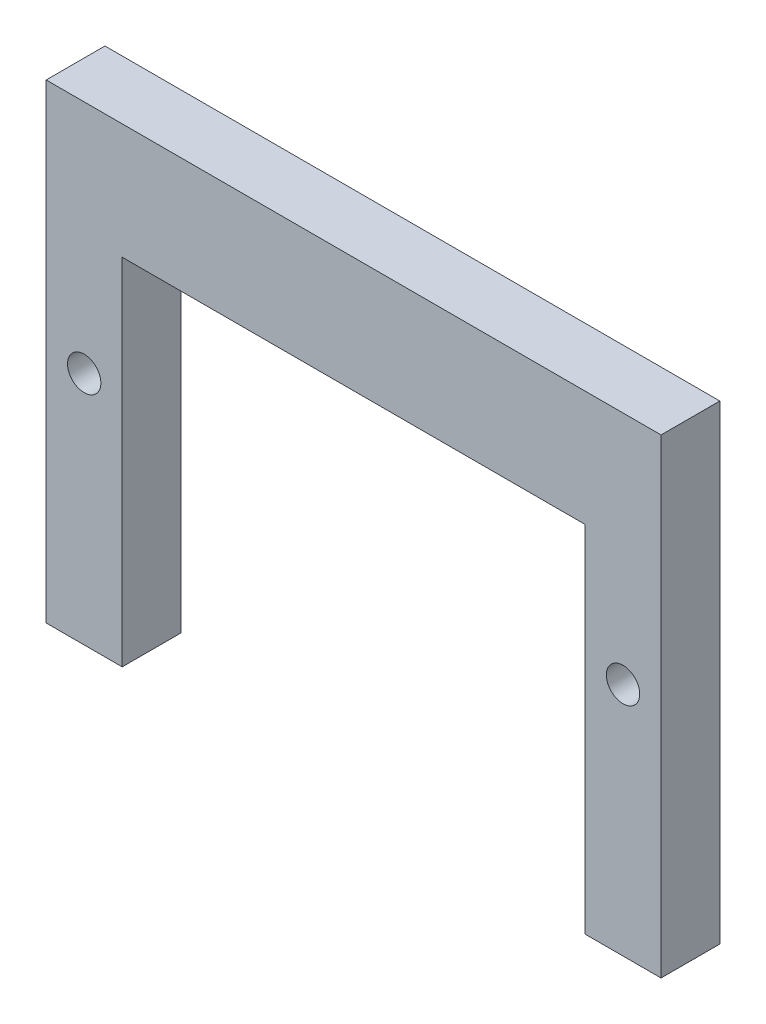
ISO-10303-21;
HEADER;
FILE_DESCRIPTION(('STEP AP214'),'2;1');
FILE_NAME('part.step','',(''),(''),'','','');
FILE_SCHEMA(('AUTOMOTIVE_DESIGN { 1 0 10303 214 1 1 1 1 }'));
ENDSEC;
DATA;
#1=APPLICATION_CONTEXT('core data for automotive mechanical design processes');
#2=APPLICATION_PROTOCOL_DEFINITION('international standard','automotive_design',2000,#1);
#3=PRODUCT_CONTEXT('',#1,'mechanical');
#4=PRODUCT('Part','Part','',(#3));
#5=PRODUCT_RELATED_PRODUCT_CATEGORY('part','',(#4));
#6=PRODUCT_DEFINITION_FORMATION('','',#4);
#7=PRODUCT_DEFINITION_CONTEXT('part definition',#1,'design');
#8=PRODUCT_DEFINITION('design','',#6,#7);
#9=PRODUCT_DEFINITION_SHAPE('','',#8);
#10=(LENGTH_UNIT() NAMED_UNIT(*) SI_UNIT(.MILLI.,.METRE.));
#11=(NAMED_UNIT(*) PLANE_ANGLE_UNIT() SI_UNIT($,.RADIAN.));
#12=(NAMED_UNIT(*) SI_UNIT($,.STERADIAN.) SOLID_ANGLE_UNIT());
#13=UNCERTAINTY_MEASURE_WITH_UNIT(LENGTH_MEASURE(1.E-05),#10,'distance_accuracy_value','');
#14=(GEOMETRIC_REPRESENTATION_CONTEXT(3) GLOBAL_UNCERTAINTY_ASSIGNED_CONTEXT((#13)) GLOBAL_UNIT_ASSIGNED_CONTEXT((#10,
#11,#12)) REPRESENTATION_CONTEXT('',''));
#15=CARTESIAN_POINT('',(0.,0.,0.));
#16=DIRECTION('',(0.,0.,1.));
#17=DIRECTION('',(1.,0.,0.));
#18=AXIS2_PLACEMENT_3D('',#15,#16,#17);
#19=CARTESIAN_POINT('',(0.,0.,3.));
#20=DIRECTION('',(0.,0.,1.));
#21=DIRECTION('',(1.,0.,0.));
#22=AXIS2_PLACEMENT_3D('',#19,#20,#21);
#23=PLANE('',#22);
#24=CARTESIAN_POINT('',(-13.751,12.0021,3.));
#25=DIRECTION('',(0.,0.,1.));
#26=DIRECTION('',(1.,0.,0.));
#27=AXIS2_PLACEMENT_3D('',#24,#25,#26);
#28=CIRCLE('',#27,0.850900000000001);
#29=CARTESIAN_POINT('',(-12.9001,12.0021,3.));
#30=VERTEX_POINT('',#29);
#31=EDGE_CURVE('E134',#30,#30,#28,.T.);
#32=ORIENTED_EDGE('',*,*,#31,.F.);
#33=EDGE_LOOP('',(#32));
#34=FACE_BOUND('',#33,.T.);
#35=DIRECTION('',(0.,-1.,0.));
#36=VECTOR('',#35,1.);
#37=CARTESIAN_POINT('',(-15.691,24.0041,3.));
#38=LINE('',#37,#36);
#39=CARTESIAN_POINT('',(-15.691,24.0041,3.));
#40=VERTEX_POINT('',#39);
#41=CARTESIAN_POINT('',(-15.691,0.,3.));
#42=VERTEX_POINT('',#41);
#43=EDGE_CURVE('E145',#40,#42,#38,.T.);
#44=ORIENTED_EDGE('',*,*,#43,.T.);
#45=DIRECTION('',(1.,0.,0.));
#46=VECTOR('',#45,1.);
#47=CARTESIAN_POINT('',(-15.691,0.,3.));
#48=LINE('',#47,#46);
#49=CARTESIAN_POINT('',(-11.811,0.,3.));
#50=VERTEX_POINT('',#49);
#51=EDGE_CURVE('E93',#42,#50,#48,.T.);
#52=ORIENTED_EDGE('',*,*,#51,.T.);
#53=DIRECTION('',(0.,1.,0.));
#54=VECTOR('',#53,1.);
#55=CARTESIAN_POINT('',(-11.811,0.,3.));
#56=LINE('',#55,#54);
#57=CARTESIAN_POINT('',(-11.811,18.1091,3.));
#58=VERTEX_POINT('',#57);
#59=EDGE_CURVE('E160',#50,#58,#56,.T.);
#60=ORIENTED_EDGE('',*,*,#59,.T.);
#61=DIRECTION('',(1.,0.,0.));
#62=VECTOR('',#61,1.);
#63=CARTESIAN_POINT('',(-11.811,18.1091,3.));
#64=LINE('',#63,#62);
#65=CARTESIAN_POINT('',(11.811,18.1091,3.));
#66=VERTEX_POINT('',#65);
#67=EDGE_CURVE('E173',#58,#66,#64,.T.);
#68=ORIENTED_EDGE('',*,*,#67,.T.);
#69=DIRECTION('',(0.,-1.,0.));
#70=VECTOR('',#69,1.);
#71=CARTESIAN_POINT('',(11.811,0.,3.));
#72=LINE('',#71,#70);
#73=CARTESIAN_POINT('',(11.811,0.,3.));
#74=VERTEX_POINT('',#73);
#75=EDGE_CURVE('E112',#66,#74,#72,.T.);
#76=ORIENTED_EDGE('',*,*,#75,.T.);
#77=DIRECTION('',(1.,0.,0.));
#78=VECTOR('',#77,1.);
#79=CARTESIAN_POINT('',(15.691,0.,3.));
#80=LINE('',#79,#78);
#81=CARTESIAN_POINT('',(15.691,0.,3.));
#82=VERTEX_POINT('',#81);
#83=EDGE_CURVE('E106',#74,#82,#80,.T.);
#84=ORIENTED_EDGE('',*,*,#83,.T.);
#85=DIRECTION('',(0.,1.,0.));
#86=VECTOR('',#85,1.);
#87=CARTESIAN_POINT('',(15.691,24.0041,3.));
#88=LINE('',#87,#86);
#89=CARTESIAN_POINT('',(15.691,24.0041,3.));
#90=VERTEX_POINT('',#89);
#91=EDGE_CURVE('E110',#82,#90,#88,.T.);
#92=ORIENTED_EDGE('',*,*,#91,.T.);
#93=DIRECTION('',(-1.,0.,0.));
#94=VECTOR('',#93,1.);
#95=CARTESIAN_POINT('',(15.691,24.0041,3.));
#96=LINE('',#95,#94);
#97=EDGE_CURVE('E50',#90,#40,#96,.T.);
#98=ORIENTED_EDGE('',*,*,#97,.T.);
#99=EDGE_LOOP('',(#44,#52,#60,#68,#76,#84,#92,#98));
#100=FACE_BOUND('',#99,.T.);
#101=CARTESIAN_POINT('',(13.751,12.0021,3.));
#102=DIRECTION('',(0.,0.,1.));
#103=DIRECTION('',(-1.,0.,0.));
#104=AXIS2_PLACEMENT_3D('',#101,#102,#103);
#105=CIRCLE('',#104,0.850900000000001);
#106=CARTESIAN_POINT('',(12.9001,12.0021,3.));
#107=VERTEX_POINT('',#106);
#108=EDGE_CURVE('E182',#107,#107,#105,.T.);
#109=ORIENTED_EDGE('',*,*,#108,.F.);
#110=EDGE_LOOP('',(#109));
#111=FACE_BOUND('',#110,.T.);
#112=ADVANCED_FACE('F33',(#34,#100,#111),#23,.T.);
#113=CARTESIAN_POINT('',(0.,0.,0.));
#114=DIRECTION('',(0.,0.,1.));
#115=DIRECTION('',(1.,0.,0.));
#116=AXIS2_PLACEMENT_3D('',#113,#114,#115);
#117=PLANE('',#116);
#118=CARTESIAN_POINT('',(-13.751,12.0021,0.));
#119=DIRECTION('',(0.,0.,1.));
#120=DIRECTION('',(1.,0.,0.));
#121=AXIS2_PLACEMENT_3D('',#118,#119,#120);
#122=CIRCLE('',#121,0.850900000000001);
#123=CARTESIAN_POINT('',(-12.9001,12.0021,0.));
#124=VERTEX_POINT('',#123);
#125=EDGE_CURVE('E179',#124,#124,#122,.T.);
#126=ORIENTED_EDGE('',*,*,#125,.T.);
#127=EDGE_LOOP('',(#126));
#128=FACE_BOUND('',#127,.T.);
#129=DIRECTION('',(0.,-1.,0.));
#130=VECTOR('',#129,1.);
#131=CARTESIAN_POINT('',(-15.691,24.0041,0.));
#132=LINE('',#131,#130);
#133=CARTESIAN_POINT('',(-15.691,24.0041,0.));
#134=VERTEX_POINT('',#133);
#135=CARTESIAN_POINT('',(-15.691,0.,0.));
#136=VERTEX_POINT('',#135);
#137=EDGE_CURVE('E130',#134,#136,#132,.T.);
#138=ORIENTED_EDGE('',*,*,#137,.F.);
#139=DIRECTION('',(-1.,0.,0.));
#140=VECTOR('',#139,1.);
#141=CARTESIAN_POINT('',(15.691,24.0041,0.));
#142=LINE('',#141,#140);
#143=CARTESIAN_POINT('',(15.691,24.0041,0.));
#144=VERTEX_POINT('',#143);
#145=EDGE_CURVE('E85',#144,#134,#142,.T.);
#146=ORIENTED_EDGE('',*,*,#145,.F.);
#147=DIRECTION('',(0.,1.,0.));
#148=VECTOR('',#147,1.);
#149=CARTESIAN_POINT('',(15.691,24.0041,0.));
#150=LINE('',#149,#148);
#151=CARTESIAN_POINT('',(15.691,0.,0.));
#152=VERTEX_POINT('',#151);
#153=EDGE_CURVE('E79',#152,#144,#150,.T.);
#154=ORIENTED_EDGE('',*,*,#153,.F.);
#155=DIRECTION('',(1.,0.,0.));
#156=VECTOR('',#155,1.);
#157=CARTESIAN_POINT('',(15.691,0.,0.));
#158=LINE('',#157,#156);
#159=CARTESIAN_POINT('',(11.811,0.,0.));
#160=VERTEX_POINT('',#159);
#161=EDGE_CURVE('E120',#160,#152,#158,.T.);
#162=ORIENTED_EDGE('',*,*,#161,.F.);
#163=DIRECTION('',(0.,-1.,0.));
#164=VECTOR('',#163,1.);
#165=CARTESIAN_POINT('',(11.811,0.,0.));
#166=LINE('',#165,#164);
#167=CARTESIAN_POINT('',(11.811,18.1091,0.));
#168=VERTEX_POINT('',#167);
#169=EDGE_CURVE('E140',#168,#160,#166,.T.);
#170=ORIENTED_EDGE('',*,*,#169,.F.);
#171=DIRECTION('',(1.,0.,0.));
#172=VECTOR('',#171,1.);
#173=CARTESIAN_POINT('',(-11.811,18.1091,0.));
#174=LINE('',#173,#172);
#175=CARTESIAN_POINT('',(-11.811,18.1091,0.));
#176=VERTEX_POINT('',#175);
#177=EDGE_CURVE('E138',#176,#168,#174,.T.);
#178=ORIENTED_EDGE('',*,*,#177,.F.);
#179=DIRECTION('',(0.,1.,0.));
#180=VECTOR('',#179,1.);
#181=CARTESIAN_POINT('',(-11.811,0.,0.));
#182=LINE('',#181,#180);
#183=CARTESIAN_POINT('',(-11.811,0.,0.));
#184=VERTEX_POINT('',#183);
#185=EDGE_CURVE('E136',#184,#176,#182,.T.);
#186=ORIENTED_EDGE('',*,*,#185,.F.);
#187=DIRECTION('',(1.,0.,0.));
#188=VECTOR('',#187,1.);
#189=CARTESIAN_POINT('',(-15.691,0.,0.));
#190=LINE('',#189,#188);
#191=EDGE_CURVE('E133',#136,#184,#190,.T.);
#192=ORIENTED_EDGE('',*,*,#191,.F.);
#193=EDGE_LOOP('',(#138,#146,#154,#162,#170,#178,#186,#192));
#194=FACE_BOUND('',#193,.T.);
#195=CARTESIAN_POINT('',(13.751,12.0021,0.));
#196=DIRECTION('',(0.,0.,1.));
#197=DIRECTION('',(-1.,0.,0.));
#198=AXIS2_PLACEMENT_3D('',#195,#196,#197);
#199=CIRCLE('',#198,0.850900000000001);
#200=CARTESIAN_POINT('',(12.9001,12.0021,0.));
#201=VERTEX_POINT('',#200);
#202=EDGE_CURVE('E185',#201,#201,#199,.T.);
#203=ORIENTED_EDGE('',*,*,#202,.T.);
#204=EDGE_LOOP('',(#203));
#205=FACE_BOUND('',#204,.T.);
#206=ADVANCED_FACE('F164',(#128,#194,#205),#117,.F.);
#207=CARTESIAN_POINT('',(-15.691,24.0041,3.));
#208=DIRECTION('',(1.,0.,0.));
#209=DIRECTION('',(0.,1.,0.));
#210=AXIS2_PLACEMENT_3D('',#207,#208,#209);
#211=PLANE('',#210);
#212=ORIENTED_EDGE('',*,*,#137,.T.);
#213=DIRECTION('',(0.,0.,-1.));
#214=VECTOR('',#213,1.);
#215=CARTESIAN_POINT('',(-15.691,0.,3.));
#216=LINE('',#215,#214);
#217=EDGE_CURVE('E11',#42,#136,#216,.T.);
#218=ORIENTED_EDGE('',*,*,#217,.F.);
#219=ORIENTED_EDGE('',*,*,#43,.F.);
#220=DIRECTION('',(0.,0.,-1.));
#221=VECTOR('',#220,1.);
#222=CARTESIAN_POINT('',(-15.691,24.0041,3.));
#223=LINE('',#222,#221);
#224=EDGE_CURVE('E126',#40,#134,#223,.T.);
#225=ORIENTED_EDGE('',*,*,#224,.T.);
#226=EDGE_LOOP('',(#212,#218,#219,#225));
#227=FACE_BOUND('',#226,.T.);
#228=ADVANCED_FACE('F35',(#227),#211,.F.);
#229=CARTESIAN_POINT('',(-15.691,0.,3.));
#230=DIRECTION('',(0.,1.,0.));
#231=DIRECTION('',(-1.,0.,0.));
#232=AXIS2_PLACEMENT_3D('',#229,#230,#231);
#233=PLANE('',#232);
#234=ORIENTED_EDGE('',*,*,#191,.T.);
#235=DIRECTION('',(0.,0.,-1.));
#236=VECTOR('',#235,1.);
#237=CARTESIAN_POINT('',(-11.811,0.,3.));
#238=LINE('',#237,#236);
#239=EDGE_CURVE('E42',#50,#184,#238,.T.);
#240=ORIENTED_EDGE('',*,*,#239,.F.);
#241=ORIENTED_EDGE('',*,*,#51,.F.);
#242=ORIENTED_EDGE('',*,*,#217,.T.);
#243=EDGE_LOOP('',(#234,#240,#241,#242));
#244=FACE_BOUND('',#243,.T.);
#245=ADVANCED_FACE('F218',(#244),#233,.F.);
#246=CARTESIAN_POINT('',(-11.811,0.,3.));
#247=DIRECTION('',(-1.,0.,0.));
#248=DIRECTION('',(0.,0.,1.));
#249=AXIS2_PLACEMENT_3D('',#246,#247,#248);
#250=PLANE('',#249);
#251=ORIENTED_EDGE('',*,*,#185,.T.);
#252=DIRECTION('',(0.,0.,-1.));
#253=VECTOR('',#252,1.);
#254=CARTESIAN_POINT('',(-11.811,18.1091,3.));
#255=LINE('',#254,#253);
#256=EDGE_CURVE('E152',#58,#176,#255,.T.);
#257=ORIENTED_EDGE('',*,*,#256,.F.);
#258=ORIENTED_EDGE('',*,*,#59,.F.);
#259=ORIENTED_EDGE('',*,*,#239,.T.);
#260=EDGE_LOOP('',(#251,#257,#258,#259));
#261=FACE_BOUND('',#260,.T.);
#262=ADVANCED_FACE('F158',(#261),#250,.F.);
#263=CARTESIAN_POINT('',(-11.811,18.1091,3.));
#264=DIRECTION('',(0.,1.,0.));
#265=DIRECTION('',(-1.,0.,0.));
#266=AXIS2_PLACEMENT_3D('',#263,#264,#265);
#267=PLANE('',#266);
#268=ORIENTED_EDGE('',*,*,#177,.T.);
#269=DIRECTION('',(0.,0.,-1.));
#270=VECTOR('',#269,1.);
#271=CARTESIAN_POINT('',(11.811,18.1091,3.));
#272=LINE('',#271,#270);
#273=EDGE_CURVE('E149',#66,#168,#272,.T.);
#274=ORIENTED_EDGE('',*,*,#273,.F.);
#275=ORIENTED_EDGE('',*,*,#67,.F.);
#276=ORIENTED_EDGE('',*,*,#256,.T.);
#277=EDGE_LOOP('',(#268,#274,#275,#276));
#278=FACE_BOUND('',#277,.T.);
#279=ADVANCED_FACE('F169',(#278),#267,.F.);
#280=CARTESIAN_POINT('',(11.811,0.,3.));
#281=DIRECTION('',(1.,0.,0.));
#282=DIRECTION('',(0.,1.,0.));
#283=AXIS2_PLACEMENT_3D('',#280,#281,#282);
#284=PLANE('',#283);
#285=ORIENTED_EDGE('',*,*,#169,.T.);
#286=DIRECTION('',(0.,0.,-1.));
#287=VECTOR('',#286,1.);
#288=CARTESIAN_POINT('',(11.811,0.,3.));
#289=LINE('',#288,#287);
#290=EDGE_CURVE('E121',#74,#160,#289,.T.);
#291=ORIENTED_EDGE('',*,*,#290,.F.);
#292=ORIENTED_EDGE('',*,*,#75,.F.);
#293=ORIENTED_EDGE('',*,*,#273,.T.);
#294=EDGE_LOOP('',(#285,#291,#292,#293));
#295=FACE_BOUND('',#294,.T.);
#296=ADVANCED_FACE('F172',(#295),#284,.F.);
#297=CARTESIAN_POINT('',(15.691,0.,3.));
#298=DIRECTION('',(0.,1.,0.));
#299=DIRECTION('',(-1.,0.,0.));
#300=AXIS2_PLACEMENT_3D('',#297,#298,#299);
#301=PLANE('',#300);
#302=ORIENTED_EDGE('',*,*,#161,.T.);
#303=DIRECTION('',(0.,0.,-1.));
#304=VECTOR('',#303,1.);
#305=CARTESIAN_POINT('',(15.691,0.,3.));
#306=LINE('',#305,#304);
#307=EDGE_CURVE('E117',#82,#152,#306,.T.);
#308=ORIENTED_EDGE('',*,*,#307,.F.);
#309=ORIENTED_EDGE('',*,*,#83,.F.);
#310=ORIENTED_EDGE('',*,*,#290,.T.);
#311=EDGE_LOOP('',(#302,#308,#309,#310));
#312=FACE_BOUND('',#311,.T.);
#313=ADVANCED_FACE('F118',(#312),#301,.F.);
#314=CARTESIAN_POINT('',(15.691,24.0041,3.));
#315=DIRECTION('',(-1.,0.,0.));
#316=DIRECTION('',(0.,-1.,0.));
#317=AXIS2_PLACEMENT_3D('',#314,#315,#316);
#318=PLANE('',#317);
#319=ORIENTED_EDGE('',*,*,#153,.T.);
#320=DIRECTION('',(0.,0.,-1.));
#321=VECTOR('',#320,1.);
#322=CARTESIAN_POINT('',(15.691,24.0041,3.));
#323=LINE('',#322,#321);
#324=EDGE_CURVE('E122',#90,#144,#323,.T.);
#325=ORIENTED_EDGE('',*,*,#324,.F.);
#326=ORIENTED_EDGE('',*,*,#91,.F.);
#327=ORIENTED_EDGE('',*,*,#307,.T.);
#328=EDGE_LOOP('',(#319,#325,#326,#327));
#329=FACE_BOUND('',#328,.T.);
#330=ADVANCED_FACE('F124',(#329),#318,.F.);
#331=CARTESIAN_POINT('',(15.691,24.0041,3.));
#332=DIRECTION('',(0.,-1.,0.));
#333=DIRECTION('',(1.,0.,0.));
#334=AXIS2_PLACEMENT_3D('',#331,#332,#333);
#335=PLANE('',#334);
#336=ORIENTED_EDGE('',*,*,#145,.T.);
#337=ORIENTED_EDGE('',*,*,#224,.F.);
#338=ORIENTED_EDGE('',*,*,#97,.F.);
#339=ORIENTED_EDGE('',*,*,#324,.T.);
#340=EDGE_LOOP('',(#336,#337,#338,#339));
#341=FACE_BOUND('',#340,.T.);
#342=ADVANCED_FACE('F206',(#341),#335,.F.);
#343=CARTESIAN_POINT('',(-13.751,12.0021,3.));
#344=DIRECTION('',(0.,0.,-1.));
#345=DIRECTION('',(-1.,0.,0.));
#346=AXIS2_PLACEMENT_3D('',#343,#344,#345);
#347=CYLINDRICAL_SURFACE('',#346,0.850900000000001);
#348=ORIENTED_EDGE('',*,*,#31,.T.);
#349=EDGE_LOOP('',(#348));
#350=FACE_BOUND('',#349,.T.);
#351=ORIENTED_EDGE('',*,*,#125,.F.);
#352=EDGE_LOOP('',(#351));
#353=FACE_BOUND('',#352,.T.);
#354=ADVANCED_FACE('F203',(#350,#353),#347,.F.);
#355=CARTESIAN_POINT('',(13.751,12.0021,3.));
#356=DIRECTION('',(0.,0.,-1.));
#357=DIRECTION('',(-1.,0.,0.));
#358=AXIS2_PLACEMENT_3D('',#355,#356,#357);
#359=CYLINDRICAL_SURFACE('',#358,0.850900000000001);
#360=ORIENTED_EDGE('',*,*,#108,.T.);
#361=EDGE_LOOP('',(#360));
#362=FACE_BOUND('',#361,.T.);
#363=ORIENTED_EDGE('',*,*,#202,.F.);
#364=EDGE_LOOP('',(#363));
#365=FACE_BOUND('',#364,.T.);
#366=ADVANCED_FACE('F191',(#362,#365),#359,.F.);
#367=CLOSED_SHELL('',(#112,#206,#228,#245,#262,#279,#296,#313,#330,#342,#354,#366));
#368=MANIFOLD_SOLID_BREP('B2',#367);
#369=ADVANCED_BREP_SHAPE_REPRESENTATION('',(#18,#368),#14);
#370=SHAPE_DEFINITION_REPRESENTATION(#9,#369);
ENDSEC;
END-ISO-10303-21;
